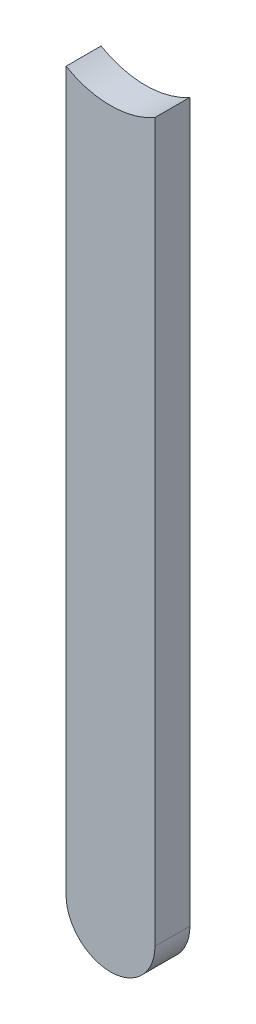
ISO-10303-21;
HEADER;
FILE_DESCRIPTION(('STEP AP214'),'2;1');
FILE_NAME('part.step','',(''),(''),'','','');
FILE_SCHEMA(('AUTOMOTIVE_DESIGN { 1 0 10303 214 1 1 1 1 }'));
ENDSEC;
DATA;
#1=APPLICATION_CONTEXT('core data for automotive mechanical design processes');
#2=APPLICATION_PROTOCOL_DEFINITION('international standard','automotive_design',2000,#1);
#3=PRODUCT_CONTEXT('',#1,'mechanical');
#4=PRODUCT('Part','Part','',(#3));
#5=PRODUCT_RELATED_PRODUCT_CATEGORY('part','',(#4));
#6=PRODUCT_DEFINITION_FORMATION('','',#4);
#7=PRODUCT_DEFINITION_CONTEXT('part definition',#1,'design');
#8=PRODUCT_DEFINITION('design','',#6,#7);
#9=PRODUCT_DEFINITION_SHAPE('','',#8);
#10=(LENGTH_UNIT() NAMED_UNIT(*) SI_UNIT(.MILLI.,.METRE.));
#11=(NAMED_UNIT(*) PLANE_ANGLE_UNIT() SI_UNIT($,.RADIAN.));
#12=(NAMED_UNIT(*) SI_UNIT($,.STERADIAN.) SOLID_ANGLE_UNIT());
#13=UNCERTAINTY_MEASURE_WITH_UNIT(LENGTH_MEASURE(1.E-05),#10,'distance_accuracy_value','');
#14=(GEOMETRIC_REPRESENTATION_CONTEXT(3) GLOBAL_UNCERTAINTY_ASSIGNED_CONTEXT((#13)) GLOBAL_UNIT_ASSIGNED_CONTEXT((#10,
#11,#12)) REPRESENTATION_CONTEXT('',''));
#15=CARTESIAN_POINT('',(0.,0.,0.));
#16=DIRECTION('',(0.,0.,1.));
#17=DIRECTION('',(1.,0.,0.));
#18=AXIS2_PLACEMENT_3D('',#15,#16,#17);
#19=CARTESIAN_POINT('',(141.732,113.440972,0.));
#20=DIRECTION('',(-1.,0.,0.));
#21=DIRECTION('',(0.,1.,0.));
#22=AXIS2_PLACEMENT_3D('',#19,#20,#21);
#23=PLANE('',#22);
#24=DIRECTION('',(0.,1.,0.));
#25=VECTOR('',#24,1.);
#26=CARTESIAN_POINT('',(141.732,113.440972,0.1999996));
#27=LINE('',#26,#25);
#28=CARTESIAN_POINT('',(141.732,113.440972,0.1999996));
#29=VERTEX_POINT('',#28);
#30=CARTESIAN_POINT('',(141.732,117.543059094878,0.1999996));
#31=VERTEX_POINT('',#30);
#32=EDGE_CURVE('E11',#29,#31,#27,.T.);
#33=ORIENTED_EDGE('',*,*,#32,.F.);
#34=DIRECTION('',(0.,0.,1.));
#35=VECTOR('',#34,1.);
#36=CARTESIAN_POINT('',(141.732,113.440972,0.));
#37=LINE('',#36,#35);
#38=CARTESIAN_POINT('',(141.732,113.440972,0.));
#39=VERTEX_POINT('',#38);
#40=EDGE_CURVE('E24',#39,#29,#37,.T.);
#41=ORIENTED_EDGE('',*,*,#40,.F.);
#42=DIRECTION('',(0.,1.,0.));
#43=VECTOR('',#42,1.);
#44=CARTESIAN_POINT('',(141.732,113.440972,0.));
#45=LINE('',#44,#43);
#46=CARTESIAN_POINT('',(141.732,117.543059094878,0.));
#47=VERTEX_POINT('',#46);
#48=EDGE_CURVE('E75',#39,#47,#45,.T.);
#49=ORIENTED_EDGE('',*,*,#48,.T.);
#50=DIRECTION('',(0.,0.,1.));
#51=VECTOR('',#50,1.);
#52=CARTESIAN_POINT('',(141.732,117.543059094878,0.));
#53=LINE('',#52,#51);
#54=EDGE_CURVE('E37',#47,#31,#53,.T.);
#55=ORIENTED_EDGE('',*,*,#54,.T.);
#56=EDGE_LOOP('',(#33,#41,#49,#55));
#57=FACE_BOUND('',#56,.T.);
#58=ADVANCED_FACE('F17',(#57),#23,.F.);
#59=CARTESIAN_POINT('',(141.478,117.983,0.));
#60=DIRECTION('',(0.,0.,-1.));
#61=DIRECTION('',(1.,0.,0.));
#62=AXIS2_PLACEMENT_3D('',#59,#60,#61);
#63=CYLINDRICAL_SURFACE('',#62,0.508);
#64=DIRECTION('',(0.,0.,1.));
#65=VECTOR('',#64,1.);
#66=CARTESIAN_POINT('',(141.224,117.543059094878,0.));
#67=LINE('',#66,#65);
#68=CARTESIAN_POINT('',(141.224,117.543059094878,0.));
#69=VERTEX_POINT('',#68);
#70=CARTESIAN_POINT('',(141.224,117.543059094878,0.1999996));
#71=VERTEX_POINT('',#70);
#72=EDGE_CURVE('E67',#69,#71,#67,.T.);
#73=ORIENTED_EDGE('',*,*,#72,.T.);
#74=CARTESIAN_POINT('',(141.478,117.983,0.1999996));
#75=DIRECTION('',(0.,0.,1.));
#76=DIRECTION('',(1.,0.,0.));
#77=AXIS2_PLACEMENT_3D('',#74,#75,#76);
#78=CIRCLE('',#77,0.508);
#79=EDGE_CURVE('E82',#71,#31,#78,.T.);
#80=ORIENTED_EDGE('',*,*,#79,.T.);
#81=ORIENTED_EDGE('',*,*,#54,.F.);
#82=CARTESIAN_POINT('',(141.478,117.983,0.));
#83=DIRECTION('',(0.,0.,1.));
#84=DIRECTION('',(1.,0.,0.));
#85=AXIS2_PLACEMENT_3D('',#82,#83,#84);
#86=CIRCLE('',#85,0.508);
#87=EDGE_CURVE('E80',#69,#47,#86,.T.);
#88=ORIENTED_EDGE('',*,*,#87,.F.);
#89=EDGE_LOOP('',(#73,#80,#81,#88));
#90=FACE_BOUND('',#89,.T.);
#91=ADVANCED_FACE('F88',(#90),#63,.F.);
#92=CARTESIAN_POINT('',(141.224,117.543059094878,0.));
#93=DIRECTION('',(1.,0.,0.));
#94=DIRECTION('',(0.,-1.,0.));
#95=AXIS2_PLACEMENT_3D('',#92,#93,#94);
#96=PLANE('',#95);
#97=DIRECTION('',(0.,-1.,0.));
#98=VECTOR('',#97,1.);
#99=CARTESIAN_POINT('',(141.224,117.983,0.1999996));
#100=LINE('',#99,#98);
#101=CARTESIAN_POINT('',(141.224,113.440972,0.1999996));
#102=VERTEX_POINT('',#101);
#103=EDGE_CURVE('E71',#71,#102,#100,.T.);
#104=ORIENTED_EDGE('',*,*,#103,.F.);
#105=ORIENTED_EDGE('',*,*,#72,.F.);
#106=DIRECTION('',(0.,-1.,0.));
#107=VECTOR('',#106,1.);
#108=CARTESIAN_POINT('',(141.224,117.983,0.));
#109=LINE('',#108,#107);
#110=CARTESIAN_POINT('',(141.224,113.440972,0.));
#111=VERTEX_POINT('',#110);
#112=EDGE_CURVE('E63',#69,#111,#109,.T.);
#113=ORIENTED_EDGE('',*,*,#112,.T.);
#114=DIRECTION('',(0.,0.,1.));
#115=VECTOR('',#114,1.);
#116=CARTESIAN_POINT('',(141.224,113.440972,0.));
#117=LINE('',#116,#115);
#118=EDGE_CURVE('E53',#111,#102,#117,.T.);
#119=ORIENTED_EDGE('',*,*,#118,.T.);
#120=EDGE_LOOP('',(#104,#105,#113,#119));
#121=FACE_BOUND('',#120,.T.);
#122=ADVANCED_FACE('F66',(#121),#96,.F.);
#123=CARTESIAN_POINT('',(141.478,113.440972,0.));
#124=DIRECTION('',(0.,0.,-1.));
#125=DIRECTION('',(-1.,0.,0.));
#126=AXIS2_PLACEMENT_3D('',#123,#124,#125);
#127=CYLINDRICAL_SURFACE('',#126,0.25400000000001);
#128=CARTESIAN_POINT('',(141.478,113.440972,0.1999996));
#129=DIRECTION('',(0.,0.,1.));
#130=DIRECTION('',(-1.,0.,0.));
#131=AXIS2_PLACEMENT_3D('',#128,#129,#130);
#132=CIRCLE('',#131,0.25400000000001);
#133=EDGE_CURVE('E59',#102,#29,#132,.T.);
#134=ORIENTED_EDGE('',*,*,#133,.F.);
#135=ORIENTED_EDGE('',*,*,#118,.F.);
#136=CARTESIAN_POINT('',(141.478,113.440972,0.));
#137=DIRECTION('',(0.,0.,1.));
#138=DIRECTION('',(-1.,0.,0.));
#139=AXIS2_PLACEMENT_3D('',#136,#137,#138);
#140=CIRCLE('',#139,0.25400000000001);
#141=EDGE_CURVE('E57',#111,#39,#140,.T.);
#142=ORIENTED_EDGE('',*,*,#141,.T.);
#143=ORIENTED_EDGE('',*,*,#40,.T.);
#144=EDGE_LOOP('',(#134,#135,#142,#143));
#145=FACE_BOUND('',#144,.T.);
#146=ADVANCED_FACE('F55',(#145),#127,.T.);
#147=CARTESIAN_POINT('',(141.732,113.440972,0.));
#148=DIRECTION('',(0.,0.,-1.));
#149=DIRECTION('',(-1.,0.,0.));
#150=AXIS2_PLACEMENT_3D('',#147,#148,#149);
#151=PLANE('',#150);
#152=ORIENTED_EDGE('',*,*,#48,.F.);
#153=ORIENTED_EDGE('',*,*,#141,.F.);
#154=ORIENTED_EDGE('',*,*,#112,.F.);
#155=ORIENTED_EDGE('',*,*,#87,.T.);
#156=EDGE_LOOP('',(#152,#153,#154,#155));
#157=FACE_BOUND('',#156,.T.);
#158=ADVANCED_FACE('F74',(#157),#151,.T.);
#159=CARTESIAN_POINT('',(141.732,113.440972,0.1999996));
#160=DIRECTION('',(0.,0.,-1.));
#161=DIRECTION('',(-1.,0.,0.));
#162=AXIS2_PLACEMENT_3D('',#159,#160,#161);
#163=PLANE('',#162);
#164=ORIENTED_EDGE('',*,*,#133,.T.);
#165=ORIENTED_EDGE('',*,*,#32,.T.);
#166=ORIENTED_EDGE('',*,*,#79,.F.);
#167=ORIENTED_EDGE('',*,*,#103,.T.);
#168=EDGE_LOOP('',(#164,#165,#166,#167));
#169=FACE_BOUND('',#168,.T.);
#170=ADVANCED_FACE('F91',(#169),#163,.F.);
#171=CLOSED_SHELL('',(#58,#91,#122,#146,#158,#170));
#172=MANIFOLD_SOLID_BREP('B1',#171);
#173=ADVANCED_BREP_SHAPE_REPRESENTATION('',(#18,#172),#14);
#174=SHAPE_DEFINITION_REPRESENTATION(#9,#173);
ENDSEC;
END-ISO-10303-21;
